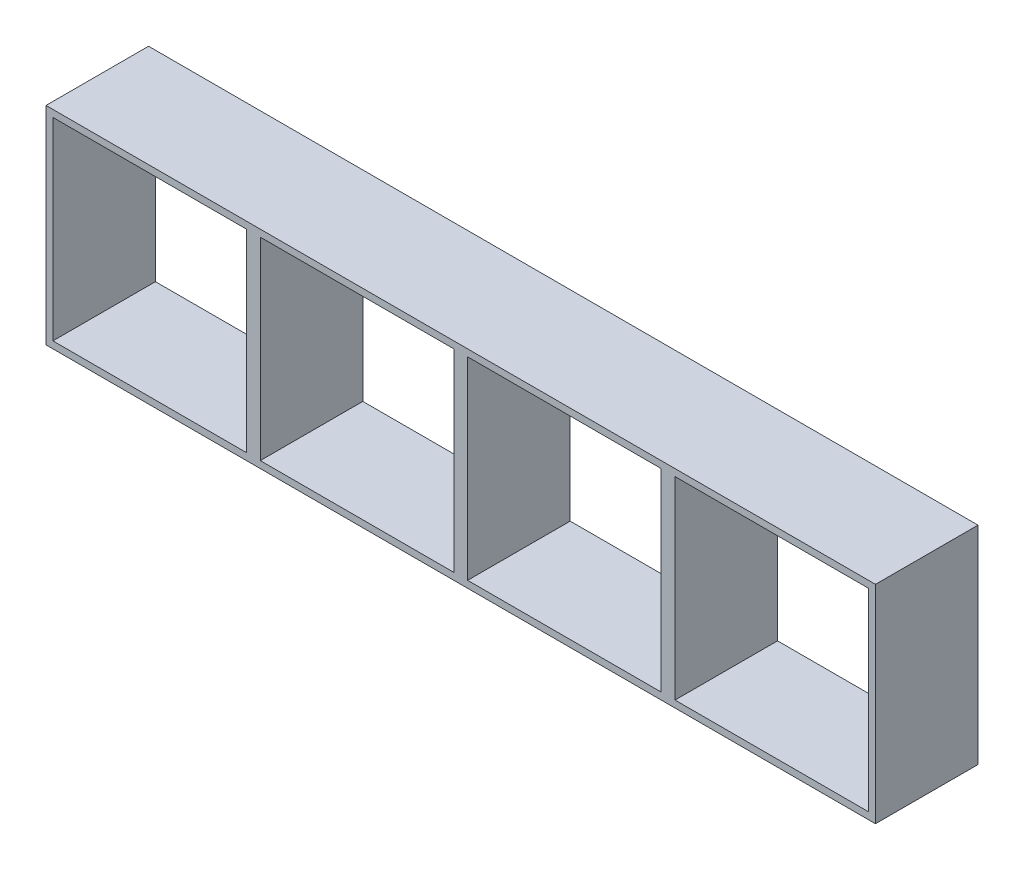
ISO-10303-21;
HEADER;
FILE_DESCRIPTION(('STEP AP214'),'2;1');
FILE_NAME('part.step','',(''),(''),'','','');
FILE_SCHEMA(('AUTOMOTIVE_DESIGN { 1 0 10303 214 1 1 1 1 }'));
ENDSEC;
DATA;
#1=APPLICATION_CONTEXT('core data for automotive mechanical design processes');
#2=APPLICATION_PROTOCOL_DEFINITION('international standard','automotive_design',2000,#1);
#3=PRODUCT_CONTEXT('',#1,'mechanical');
#4=PRODUCT('Part','Part','',(#3));
#5=PRODUCT_RELATED_PRODUCT_CATEGORY('part','',(#4));
#6=PRODUCT_DEFINITION_FORMATION('','',#4);
#7=PRODUCT_DEFINITION_CONTEXT('part definition',#1,'design');
#8=PRODUCT_DEFINITION('design','',#6,#7);
#9=PRODUCT_DEFINITION_SHAPE('','',#8);
#10=(LENGTH_UNIT() NAMED_UNIT(*) SI_UNIT(.MILLI.,.METRE.));
#11=(NAMED_UNIT(*) PLANE_ANGLE_UNIT() SI_UNIT($,.RADIAN.));
#12=(NAMED_UNIT(*) SI_UNIT($,.STERADIAN.) SOLID_ANGLE_UNIT());
#13=UNCERTAINTY_MEASURE_WITH_UNIT(LENGTH_MEASURE(1.E-05),#10,'distance_accuracy_value','');
#14=(GEOMETRIC_REPRESENTATION_CONTEXT(3) GLOBAL_UNCERTAINTY_ASSIGNED_CONTEXT((#13)) GLOBAL_UNIT_ASSIGNED_CONTEXT((#10,
#11,#12)) REPRESENTATION_CONTEXT('',''));
#15=CARTESIAN_POINT('',(0.,0.,0.));
#16=DIRECTION('',(0.,0.,1.));
#17=DIRECTION('',(1.,0.,0.));
#18=AXIS2_PLACEMENT_3D('',#15,#16,#17);
#19=CARTESIAN_POINT('',(0.,0.,14.8333333433333));
#20=DIRECTION('',(-1.,0.,0.));
#21=DIRECTION('',(0.,0.,1.));
#22=AXIS2_PLACEMENT_3D('',#19,#20,#21);
#23=PLANE('',#22);
#24=DIRECTION('',(0.,1.,0.));
#25=VECTOR('',#24,1.);
#26=CARTESIAN_POINT('',(0.,0.,0.));
#27=LINE('',#26,#25);
#28=CARTESIAN_POINT('',(0.,0.,0.));
#29=VERTEX_POINT('',#28);
#30=CARTESIAN_POINT('',(0.,30.,0.));
#31=VERTEX_POINT('',#30);
#32=EDGE_CURVE('E305',#29,#31,#27,.T.);
#33=ORIENTED_EDGE('',*,*,#32,.F.);
#34=DIRECTION('',(0.,0.,-1.));
#35=VECTOR('',#34,1.);
#36=CARTESIAN_POINT('',(0.,0.,14.8333333433333));
#37=LINE('',#36,#35);
#38=CARTESIAN_POINT('',(0.,0.,14.8333333433333));
#39=VERTEX_POINT('',#38);
#40=EDGE_CURVE('E11',#39,#29,#37,.T.);
#41=ORIENTED_EDGE('',*,*,#40,.F.);
#42=DIRECTION('',(0.,1.,0.));
#43=VECTOR('',#42,1.);
#44=CARTESIAN_POINT('',(0.,0.,14.8333333433333));
#45=LINE('',#44,#43);
#46=CARTESIAN_POINT('',(0.,30.,14.8333333433333));
#47=VERTEX_POINT('',#46);
#48=EDGE_CURVE('E200',#39,#47,#45,.T.);
#49=ORIENTED_EDGE('',*,*,#48,.T.);
#50=DIRECTION('',(0.,0.,-1.));
#51=VECTOR('',#50,1.);
#52=CARTESIAN_POINT('',(0.,30.,14.8333333433333));
#53=LINE('',#52,#51);
#54=EDGE_CURVE('E62',#47,#31,#53,.T.);
#55=ORIENTED_EDGE('',*,*,#54,.T.);
#56=EDGE_LOOP('',(#33,#41,#49,#55));
#57=FACE_BOUND('',#56,.T.);
#58=ADVANCED_FACE('F43',(#57),#23,.T.);
#59=CARTESIAN_POINT('',(0.,0.,14.8333333433333));
#60=DIRECTION('',(0.,1.,0.));
#61=DIRECTION('',(-1.,0.,0.));
#62=AXIS2_PLACEMENT_3D('',#59,#60,#61);
#63=PLANE('',#62);
#64=DIRECTION('',(1.,0.,0.));
#65=VECTOR('',#64,1.);
#66=CARTESIAN_POINT('',(0.,0.,0.));
#67=LINE('',#66,#65);
#68=CARTESIAN_POINT('',(120.,0.,0.));
#69=VERTEX_POINT('',#68);
#70=EDGE_CURVE('E205',#29,#69,#67,.T.);
#71=ORIENTED_EDGE('',*,*,#70,.T.);
#72=DIRECTION('',(0.,0.,-1.));
#73=VECTOR('',#72,1.);
#74=CARTESIAN_POINT('',(120.,0.,14.8333333433333));
#75=LINE('',#74,#73);
#76=CARTESIAN_POINT('',(120.,0.,14.8333333433333));
#77=VERTEX_POINT('',#76);
#78=EDGE_CURVE('E53',#77,#69,#75,.T.);
#79=ORIENTED_EDGE('',*,*,#78,.F.);
#80=DIRECTION('',(1.,0.,0.));
#81=VECTOR('',#80,1.);
#82=CARTESIAN_POINT('',(0.,0.,14.8333333433333));
#83=LINE('',#82,#81);
#84=EDGE_CURVE('E195',#39,#77,#83,.T.);
#85=ORIENTED_EDGE('',*,*,#84,.F.);
#86=ORIENTED_EDGE('',*,*,#40,.T.);
#87=EDGE_LOOP('',(#71,#79,#85,#86));
#88=FACE_BOUND('',#87,.T.);
#89=ADVANCED_FACE('F203',(#88),#63,.F.);
#90=CARTESIAN_POINT('',(120.,0.,14.8333333433333));
#91=DIRECTION('',(-1.,0.,0.));
#92=DIRECTION('',(0.,-1.,0.));
#93=AXIS2_PLACEMENT_3D('',#90,#91,#92);
#94=PLANE('',#93);
#95=DIRECTION('',(0.,1.,0.));
#96=VECTOR('',#95,1.);
#97=CARTESIAN_POINT('',(120.,0.,0.));
#98=LINE('',#97,#96);
#99=CARTESIAN_POINT('',(120.,30.,0.));
#100=VERTEX_POINT('',#99);
#101=EDGE_CURVE('E308',#69,#100,#98,.T.);
#102=ORIENTED_EDGE('',*,*,#101,.T.);
#103=DIRECTION('',(0.,0.,-1.));
#104=VECTOR('',#103,1.);
#105=CARTESIAN_POINT('',(120.,30.,14.8333333433333));
#106=LINE('',#105,#104);
#107=CARTESIAN_POINT('',(120.,30.,14.8333333433333));
#108=VERTEX_POINT('',#107);
#109=EDGE_CURVE('E124',#108,#100,#106,.T.);
#110=ORIENTED_EDGE('',*,*,#109,.F.);
#111=DIRECTION('',(0.,1.,0.));
#112=VECTOR('',#111,1.);
#113=CARTESIAN_POINT('',(120.,0.,14.8333333433333));
#114=LINE('',#113,#112);
#115=EDGE_CURVE('E187',#77,#108,#114,.T.);
#116=ORIENTED_EDGE('',*,*,#115,.F.);
#117=ORIENTED_EDGE('',*,*,#78,.T.);
#118=EDGE_LOOP('',(#102,#110,#116,#117));
#119=FACE_BOUND('',#118,.T.);
#120=ADVANCED_FACE('F189',(#119),#94,.F.);
#121=CARTESIAN_POINT('',(0.,1.,14.8333333433333));
#122=DIRECTION('',(0.,1.,0.));
#123=DIRECTION('',(0.,0.,1.));
#124=AXIS2_PLACEMENT_3D('',#121,#122,#123);
#125=PLANE('',#124);
#126=DIRECTION('',(1.,0.,0.));
#127=VECTOR('',#126,1.);
#128=CARTESIAN_POINT('',(0.,1.,0.));
#129=LINE('',#128,#127);
#130=CARTESIAN_POINT('',(1.,1.,0.));
#131=VERTEX_POINT('',#130);
#132=CARTESIAN_POINT('',(29.,1.,0.));
#133=VERTEX_POINT('',#132);
#134=EDGE_CURVE('E293',#131,#133,#129,.T.);
#135=ORIENTED_EDGE('',*,*,#134,.F.);
#136=DIRECTION('',(0.,0.,-1.));
#137=VECTOR('',#136,1.);
#138=CARTESIAN_POINT('',(1.,1.,14.8333333433333));
#139=LINE('',#138,#137);
#140=CARTESIAN_POINT('',(1.,1.,14.8333333433333));
#141=VERTEX_POINT('',#140);
#142=EDGE_CURVE('E217',#141,#131,#139,.T.);
#143=ORIENTED_EDGE('',*,*,#142,.F.);
#144=DIRECTION('',(1.,0.,0.));
#145=VECTOR('',#144,1.);
#146=CARTESIAN_POINT('',(0.,1.,14.8333333433333));
#147=LINE('',#146,#145);
#148=CARTESIAN_POINT('',(29.,1.,14.8333333433333));
#149=VERTEX_POINT('',#148);
#150=EDGE_CURVE('E345',#141,#149,#147,.T.);
#151=ORIENTED_EDGE('',*,*,#150,.T.);
#152=DIRECTION('',(0.,0.,-1.));
#153=VECTOR('',#152,1.);
#154=CARTESIAN_POINT('',(29.,1.,14.8333333433333));
#155=LINE('',#154,#153);
#156=EDGE_CURVE('E210',#149,#133,#155,.T.);
#157=ORIENTED_EDGE('',*,*,#156,.T.);
#158=EDGE_LOOP('',(#135,#143,#151,#157));
#159=FACE_BOUND('',#158,.T.);
#160=ADVANCED_FACE('F393',(#159),#125,.T.);
#161=CARTESIAN_POINT('',(1.,0.,14.8333333433333));
#162=DIRECTION('',(1.,0.,0.));
#163=DIRECTION('',(0.,1.,0.));
#164=AXIS2_PLACEMENT_3D('',#161,#162,#163);
#165=PLANE('',#164);
#166=DIRECTION('',(0.,-1.,0.));
#167=VECTOR('',#166,1.);
#168=CARTESIAN_POINT('',(1.,0.,0.));
#169=LINE('',#168,#167);
#170=CARTESIAN_POINT('',(1.,29.,0.));
#171=VERTEX_POINT('',#170);
#172=EDGE_CURVE('E296',#171,#131,#169,.T.);
#173=ORIENTED_EDGE('',*,*,#172,.F.);
#174=DIRECTION('',(0.,0.,-1.));
#175=VECTOR('',#174,1.);
#176=CARTESIAN_POINT('',(1.,29.,14.8333333433333));
#177=LINE('',#176,#175);
#178=CARTESIAN_POINT('',(1.,29.,14.8333333433333));
#179=VERTEX_POINT('',#178);
#180=EDGE_CURVE('E215',#179,#171,#177,.T.);
#181=ORIENTED_EDGE('',*,*,#180,.F.);
#182=DIRECTION('',(0.,-1.,0.));
#183=VECTOR('',#182,1.);
#184=CARTESIAN_POINT('',(1.,0.,14.8333333433333));
#185=LINE('',#184,#183);
#186=EDGE_CURVE('E348',#179,#141,#185,.T.);
#187=ORIENTED_EDGE('',*,*,#186,.T.);
#188=ORIENTED_EDGE('',*,*,#142,.T.);
#189=EDGE_LOOP('',(#173,#181,#187,#188));
#190=FACE_BOUND('',#189,.T.);
#191=ADVANCED_FACE('F389',(#190),#165,.T.);
#192=CARTESIAN_POINT('',(0.,29.,14.8333333433333));
#193=DIRECTION('',(0.,-1.,0.));
#194=DIRECTION('',(1.,0.,0.));
#195=AXIS2_PLACEMENT_3D('',#192,#193,#194);
#196=PLANE('',#195);
#197=DIRECTION('',(-1.,0.,0.));
#198=VECTOR('',#197,1.);
#199=CARTESIAN_POINT('',(0.,29.,0.));
#200=LINE('',#199,#198);
#201=CARTESIAN_POINT('',(29.,29.,0.));
#202=VERTEX_POINT('',#201);
#203=EDGE_CURVE('E299',#202,#171,#200,.T.);
#204=ORIENTED_EDGE('',*,*,#203,.F.);
#205=DIRECTION('',(0.,0.,-1.));
#206=VECTOR('',#205,1.);
#207=CARTESIAN_POINT('',(29.,29.,14.8333333433333));
#208=LINE('',#207,#206);
#209=CARTESIAN_POINT('',(29.,29.,14.8333333433333));
#210=VERTEX_POINT('',#209);
#211=EDGE_CURVE('E212',#210,#202,#208,.T.);
#212=ORIENTED_EDGE('',*,*,#211,.F.);
#213=DIRECTION('',(-1.,0.,0.));
#214=VECTOR('',#213,1.);
#215=CARTESIAN_POINT('',(0.,29.,14.8333333433333));
#216=LINE('',#215,#214);
#217=EDGE_CURVE('E351',#210,#179,#216,.T.);
#218=ORIENTED_EDGE('',*,*,#217,.T.);
#219=ORIENTED_EDGE('',*,*,#180,.T.);
#220=EDGE_LOOP('',(#204,#212,#218,#219));
#221=FACE_BOUND('',#220,.T.);
#222=ADVANCED_FACE('F385',(#221),#196,.T.);
#223=CARTESIAN_POINT('',(0.,0.999999999999982,14.8333333433333));
#224=DIRECTION('',(0.,1.,0.));
#225=DIRECTION('',(-1.,0.,0.));
#226=AXIS2_PLACEMENT_3D('',#223,#224,#225);
#227=PLANE('',#226);
#228=DIRECTION('',(1.,0.,0.));
#229=VECTOR('',#228,1.);
#230=CARTESIAN_POINT('',(0.,0.999999999999982,0.));
#231=LINE('',#230,#229);
#232=CARTESIAN_POINT('',(91.,1.00000000000001,0.));
#233=VERTEX_POINT('',#232);
#234=CARTESIAN_POINT('',(119.,1.00000000000002,0.));
#235=VERTEX_POINT('',#234);
#236=EDGE_CURVE('E281',#233,#235,#231,.T.);
#237=ORIENTED_EDGE('',*,*,#236,.F.);
#238=DIRECTION('',(0.,0.,-1.));
#239=VECTOR('',#238,1.);
#240=CARTESIAN_POINT('',(91.,1.00000000000001,14.8333333433333));
#241=LINE('',#240,#239);
#242=CARTESIAN_POINT('',(91.,1.00000000000001,14.8333333433333));
#243=VERTEX_POINT('',#242);
#244=EDGE_CURVE('E213',#243,#233,#241,.T.);
#245=ORIENTED_EDGE('',*,*,#244,.F.);
#246=DIRECTION('',(1.,0.,0.));
#247=VECTOR('',#246,1.);
#248=CARTESIAN_POINT('',(0.,0.999999999999982,14.8333333433333));
#249=LINE('',#248,#247);
#250=CARTESIAN_POINT('',(119.,1.00000000000002,14.8333333433333));
#251=VERTEX_POINT('',#250);
#252=EDGE_CURVE('E334',#243,#251,#249,.T.);
#253=ORIENTED_EDGE('',*,*,#252,.T.);
#254=DIRECTION('',(0.,0.,-1.));
#255=VECTOR('',#254,1.);
#256=CARTESIAN_POINT('',(119.,1.00000000000002,14.8333333433333));
#257=LINE('',#256,#255);
#258=EDGE_CURVE('E219',#251,#235,#257,.T.);
#259=ORIENTED_EDGE('',*,*,#258,.T.);
#260=EDGE_LOOP('',(#237,#245,#253,#259));
#261=FACE_BOUND('',#260,.T.);
#262=ADVANCED_FACE('F388',(#261),#227,.T.);
#263=CARTESIAN_POINT('',(91.,0.,14.8333333433333));
#264=DIRECTION('',(-1.,0.,0.));
#265=DIRECTION('',(0.,0.,1.));
#266=AXIS2_PLACEMENT_3D('',#263,#264,#265);
#267=PLANE('',#266);
#268=DIRECTION('',(0.,1.,0.));
#269=VECTOR('',#268,1.);
#270=CARTESIAN_POINT('',(91.,0.,0.));
#271=LINE('',#270,#269);
#272=CARTESIAN_POINT('',(91.,29.,0.));
#273=VERTEX_POINT('',#272);
#274=EDGE_CURVE('E284',#233,#273,#271,.T.);
#275=ORIENTED_EDGE('',*,*,#274,.T.);
#276=DIRECTION('',(0.,0.,-1.));
#277=VECTOR('',#276,1.);
#278=CARTESIAN_POINT('',(91.,29.,14.8333333433333));
#279=LINE('',#278,#277);
#280=CARTESIAN_POINT('',(91.,29.,14.8333333433333));
#281=VERTEX_POINT('',#280);
#282=EDGE_CURVE('E225',#281,#273,#279,.T.);
#283=ORIENTED_EDGE('',*,*,#282,.F.);
#284=DIRECTION('',(0.,1.,0.));
#285=VECTOR('',#284,1.);
#286=CARTESIAN_POINT('',(91.,0.,14.8333333433333));
#287=LINE('',#286,#285);
#288=EDGE_CURVE('E337',#243,#281,#287,.T.);
#289=ORIENTED_EDGE('',*,*,#288,.F.);
#290=ORIENTED_EDGE('',*,*,#244,.T.);
#291=EDGE_LOOP('',(#275,#283,#289,#290));
#292=FACE_BOUND('',#291,.T.);
#293=ADVANCED_FACE('F405',(#292),#267,.F.);
#294=CARTESIAN_POINT('',(0.,29.,14.8333333433333));
#295=DIRECTION('',(0.,1.,0.));
#296=DIRECTION('',(-1.,0.,0.));
#297=AXIS2_PLACEMENT_3D('',#294,#295,#296);
#298=PLANE('',#297);
#299=DIRECTION('',(1.,0.,0.));
#300=VECTOR('',#299,1.);
#301=CARTESIAN_POINT('',(0.,29.,0.));
#302=LINE('',#301,#300);
#303=CARTESIAN_POINT('',(119.,29.,0.));
#304=VERTEX_POINT('',#303);
#305=EDGE_CURVE('E287',#273,#304,#302,.T.);
#306=ORIENTED_EDGE('',*,*,#305,.T.);
#307=DIRECTION('',(0.,0.,-1.));
#308=VECTOR('',#307,1.);
#309=CARTESIAN_POINT('',(119.,29.,14.8333333433333));
#310=LINE('',#309,#308);
#311=CARTESIAN_POINT('',(119.,29.,14.8333333433333));
#312=VERTEX_POINT('',#311);
#313=EDGE_CURVE('E221',#312,#304,#310,.T.);
#314=ORIENTED_EDGE('',*,*,#313,.F.);
#315=DIRECTION('',(1.,0.,0.));
#316=VECTOR('',#315,1.);
#317=CARTESIAN_POINT('',(0.,29.,14.8333333433333));
#318=LINE('',#317,#316);
#319=EDGE_CURVE('E340',#281,#312,#318,.T.);
#320=ORIENTED_EDGE('',*,*,#319,.F.);
#321=ORIENTED_EDGE('',*,*,#282,.T.);
#322=EDGE_LOOP('',(#306,#314,#320,#321));
#323=FACE_BOUND('',#322,.T.);
#324=ADVANCED_FACE('F401',(#323),#298,.F.);
#325=CARTESIAN_POINT('',(0.,0.999999999999983,14.8333333433333));
#326=DIRECTION('',(0.,1.,0.));
#327=DIRECTION('',(-1.,0.,0.));
#328=AXIS2_PLACEMENT_3D('',#325,#326,#327);
#329=PLANE('',#328);
#330=DIRECTION('',(1.,0.,0.));
#331=VECTOR('',#330,1.);
#332=CARTESIAN_POINT('',(0.,0.999999999999983,0.));
#333=LINE('',#332,#331);
#334=CARTESIAN_POINT('',(61.,1.,0.));
#335=VERTEX_POINT('',#334);
#336=CARTESIAN_POINT('',(89.,1.00000000000001,0.));
#337=VERTEX_POINT('',#336);
#338=EDGE_CURVE('E269',#335,#337,#333,.T.);
#339=ORIENTED_EDGE('',*,*,#338,.F.);
#340=DIRECTION('',(0.,0.,-1.));
#341=VECTOR('',#340,1.);
#342=CARTESIAN_POINT('',(61.,1.,14.8333333433333));
#343=LINE('',#342,#341);
#344=CARTESIAN_POINT('',(61.,1.,14.8333333433333));
#345=VERTEX_POINT('',#344);
#346=EDGE_CURVE('E222',#345,#335,#343,.T.);
#347=ORIENTED_EDGE('',*,*,#346,.F.);
#348=DIRECTION('',(1.,0.,0.));
#349=VECTOR('',#348,1.);
#350=CARTESIAN_POINT('',(0.,0.999999999999983,14.8333333433333));
#351=LINE('',#350,#349);
#352=CARTESIAN_POINT('',(89.,1.00000000000001,14.8333333433333));
#353=VERTEX_POINT('',#352);
#354=EDGE_CURVE('E323',#345,#353,#351,.T.);
#355=ORIENTED_EDGE('',*,*,#354,.T.);
#356=DIRECTION('',(0.,0.,-1.));
#357=VECTOR('',#356,1.);
#358=CARTESIAN_POINT('',(89.,1.00000000000001,14.8333333433333));
#359=LINE('',#358,#357);
#360=EDGE_CURVE('E229',#353,#337,#359,.T.);
#361=ORIENTED_EDGE('',*,*,#360,.T.);
#362=EDGE_LOOP('',(#339,#347,#355,#361));
#363=FACE_BOUND('',#362,.T.);
#364=ADVANCED_FACE('F404',(#363),#329,.T.);
#365=CARTESIAN_POINT('',(61.,0.,14.8333333433333));
#366=DIRECTION('',(-1.,0.,0.));
#367=DIRECTION('',(0.,-1.,0.));
#368=AXIS2_PLACEMENT_3D('',#365,#366,#367);
#369=PLANE('',#368);
#370=DIRECTION('',(0.,1.,0.));
#371=VECTOR('',#370,1.);
#372=CARTESIAN_POINT('',(61.,0.,0.));
#373=LINE('',#372,#371);
#374=CARTESIAN_POINT('',(61.,29.,0.));
#375=VERTEX_POINT('',#374);
#376=EDGE_CURVE('E272',#335,#375,#373,.T.);
#377=ORIENTED_EDGE('',*,*,#376,.T.);
#378=DIRECTION('',(0.,0.,-1.));
#379=VECTOR('',#378,1.);
#380=CARTESIAN_POINT('',(61.,29.,14.8333333433333));
#381=LINE('',#380,#379);
#382=CARTESIAN_POINT('',(61.,29.,14.8333333433333));
#383=VERTEX_POINT('',#382);
#384=EDGE_CURVE('E234',#383,#375,#381,.T.);
#385=ORIENTED_EDGE('',*,*,#384,.F.);
#386=DIRECTION('',(0.,1.,0.));
#387=VECTOR('',#386,1.);
#388=CARTESIAN_POINT('',(61.,0.,14.8333333433333));
#389=LINE('',#388,#387);
#390=EDGE_CURVE('E326',#345,#383,#389,.T.);
#391=ORIENTED_EDGE('',*,*,#390,.F.);
#392=ORIENTED_EDGE('',*,*,#346,.T.);
#393=EDGE_LOOP('',(#377,#385,#391,#392));
#394=FACE_BOUND('',#393,.T.);
#395=ADVANCED_FACE('F419',(#394),#369,.F.);
#396=CARTESIAN_POINT('',(0.,29.,14.8333333433333));
#397=DIRECTION('',(0.,1.,0.));
#398=DIRECTION('',(0.,0.,1.));
#399=AXIS2_PLACEMENT_3D('',#396,#397,#398);
#400=PLANE('',#399);
#401=DIRECTION('',(1.,0.,0.));
#402=VECTOR('',#401,1.);
#403=CARTESIAN_POINT('',(0.,29.,0.));
#404=LINE('',#403,#402);
#405=CARTESIAN_POINT('',(89.,29.,0.));
#406=VERTEX_POINT('',#405);
#407=EDGE_CURVE('E275',#375,#406,#404,.T.);
#408=ORIENTED_EDGE('',*,*,#407,.T.);
#409=DIRECTION('',(0.,0.,-1.));
#410=VECTOR('',#409,1.);
#411=CARTESIAN_POINT('',(89.,29.,14.8333333433333));
#412=LINE('',#411,#410);
#413=CARTESIAN_POINT('',(89.,29.,14.8333333433333));
#414=VERTEX_POINT('',#413);
#415=EDGE_CURVE('E231',#414,#406,#412,.T.);
#416=ORIENTED_EDGE('',*,*,#415,.F.);
#417=DIRECTION('',(1.,0.,0.));
#418=VECTOR('',#417,1.);
#419=CARTESIAN_POINT('',(0.,29.,14.8333333433333));
#420=LINE('',#419,#418);
#421=EDGE_CURVE('E329',#383,#414,#420,.T.);
#422=ORIENTED_EDGE('',*,*,#421,.F.);
#423=ORIENTED_EDGE('',*,*,#384,.T.);
#424=EDGE_LOOP('',(#408,#416,#422,#423));
#425=FACE_BOUND('',#424,.T.);
#426=ADVANCED_FACE('F416',(#425),#400,.F.);
#427=CARTESIAN_POINT('',(0.,1.,14.8333333433333));
#428=DIRECTION('',(0.,1.,0.));
#429=DIRECTION('',(-1.,0.,0.));
#430=AXIS2_PLACEMENT_3D('',#427,#428,#429);
#431=PLANE('',#430);
#432=DIRECTION('',(1.,0.,0.));
#433=VECTOR('',#432,1.);
#434=CARTESIAN_POINT('',(0.,1.,0.));
#435=LINE('',#434,#433);
#436=CARTESIAN_POINT('',(31.,1.,0.));
#437=VERTEX_POINT('',#436);
#438=CARTESIAN_POINT('',(59.,1.,0.));
#439=VERTEX_POINT('',#438);
#440=EDGE_CURVE('E255',#437,#439,#435,.T.);
#441=ORIENTED_EDGE('',*,*,#440,.F.);
#442=DIRECTION('',(0.,0.,-1.));
#443=VECTOR('',#442,1.);
#444=CARTESIAN_POINT('',(31.,1.,14.8333333433333));
#445=LINE('',#444,#443);
#446=CARTESIAN_POINT('',(31.,1.,14.8333333433333));
#447=VERTEX_POINT('',#446);
#448=EDGE_CURVE('E47',#447,#437,#445,.T.);
#449=ORIENTED_EDGE('',*,*,#448,.F.);
#450=DIRECTION('',(1.,0.,0.));
#451=VECTOR('',#450,1.);
#452=CARTESIAN_POINT('',(0.,1.,14.8333333433333));
#453=LINE('',#452,#451);
#454=CARTESIAN_POINT('',(59.,1.,14.8333333433333));
#455=VERTEX_POINT('',#454);
#456=EDGE_CURVE('E312',#447,#455,#453,.T.);
#457=ORIENTED_EDGE('',*,*,#456,.T.);
#458=DIRECTION('',(0.,0.,-1.));
#459=VECTOR('',#458,1.);
#460=CARTESIAN_POINT('',(59.,1.,14.8333333433333));
#461=LINE('',#460,#459);
#462=EDGE_CURVE('E238',#455,#439,#461,.T.);
#463=ORIENTED_EDGE('',*,*,#462,.T.);
#464=EDGE_LOOP('',(#441,#449,#457,#463));
#465=FACE_BOUND('',#464,.T.);
#466=ADVANCED_FACE('F45',(#465),#431,.T.);
#467=CARTESIAN_POINT('',(31.,0.,14.8333333433333));
#468=DIRECTION('',(1.,0.,0.));
#469=DIRECTION('',(0.,1.,0.));
#470=AXIS2_PLACEMENT_3D('',#467,#468,#469);
#471=PLANE('',#470);
#472=DIRECTION('',(0.,-1.,0.));
#473=VECTOR('',#472,1.);
#474=CARTESIAN_POINT('',(31.,0.,0.));
#475=LINE('',#474,#473);
#476=CARTESIAN_POINT('',(31.,29.,0.));
#477=VERTEX_POINT('',#476);
#478=EDGE_CURVE('E250',#477,#437,#475,.T.);
#479=ORIENTED_EDGE('',*,*,#478,.F.);
#480=DIRECTION('',(0.,0.,-1.));
#481=VECTOR('',#480,1.);
#482=CARTESIAN_POINT('',(31.,29.,14.8333333433333));
#483=LINE('',#482,#481);
#484=CARTESIAN_POINT('',(31.,29.,14.8333333433333));
#485=VERTEX_POINT('',#484);
#486=EDGE_CURVE('E241',#485,#477,#483,.T.);
#487=ORIENTED_EDGE('',*,*,#486,.F.);
#488=DIRECTION('',(0.,-1.,0.));
#489=VECTOR('',#488,1.);
#490=CARTESIAN_POINT('',(31.,0.,14.8333333433333));
#491=LINE('',#490,#489);
#492=EDGE_CURVE('E253',#485,#447,#491,.T.);
#493=ORIENTED_EDGE('',*,*,#492,.T.);
#494=ORIENTED_EDGE('',*,*,#448,.T.);
#495=EDGE_LOOP('',(#479,#487,#493,#494));
#496=FACE_BOUND('',#495,.T.);
#497=ADVANCED_FACE('F248',(#496),#471,.T.);
#498=CARTESIAN_POINT('',(0.,29.,14.8333333433333));
#499=DIRECTION('',(0.,-1.,0.));
#500=DIRECTION('',(1.,0.,0.));
#501=AXIS2_PLACEMENT_3D('',#498,#499,#500);
#502=PLANE('',#501);
#503=DIRECTION('',(-1.,0.,0.));
#504=VECTOR('',#503,1.);
#505=CARTESIAN_POINT('',(0.,29.,0.));
#506=LINE('',#505,#504);
#507=CARTESIAN_POINT('',(59.,29.,0.));
#508=VERTEX_POINT('',#507);
#509=EDGE_CURVE('E262',#508,#477,#506,.T.);
#510=ORIENTED_EDGE('',*,*,#509,.F.);
#511=DIRECTION('',(0.,0.,-1.));
#512=VECTOR('',#511,1.);
#513=CARTESIAN_POINT('',(59.,29.,14.8333333433333));
#514=LINE('',#513,#512);
#515=CARTESIAN_POINT('',(59.,29.,14.8333333433333));
#516=VERTEX_POINT('',#515);
#517=EDGE_CURVE('E240',#516,#508,#514,.T.);
#518=ORIENTED_EDGE('',*,*,#517,.F.);
#519=DIRECTION('',(-1.,0.,0.));
#520=VECTOR('',#519,1.);
#521=CARTESIAN_POINT('',(0.,29.,14.8333333433333));
#522=LINE('',#521,#520);
#523=EDGE_CURVE('E316',#516,#485,#522,.T.);
#524=ORIENTED_EDGE('',*,*,#523,.T.);
#525=ORIENTED_EDGE('',*,*,#486,.T.);
#526=EDGE_LOOP('',(#510,#518,#524,#525));
#527=FACE_BOUND('',#526,.T.);
#528=ADVANCED_FACE('F383',(#527),#502,.T.);
#529=CARTESIAN_POINT('',(29.,0.,14.8333333433333));
#530=DIRECTION('',(-1.,0.,0.));
#531=DIRECTION('',(0.,0.,1.));
#532=AXIS2_PLACEMENT_3D('',#529,#530,#531);
#533=PLANE('',#532);
#534=DIRECTION('',(0.,1.,0.));
#535=VECTOR('',#534,1.);
#536=CARTESIAN_POINT('',(29.,0.,0.));
#537=LINE('',#536,#535);
#538=EDGE_CURVE('E302',#133,#202,#537,.T.);
#539=ORIENTED_EDGE('',*,*,#538,.F.);
#540=ORIENTED_EDGE('',*,*,#156,.F.);
#541=DIRECTION('',(0.,1.,0.));
#542=VECTOR('',#541,1.);
#543=CARTESIAN_POINT('',(29.,0.,14.8333333433333));
#544=LINE('',#543,#542);
#545=EDGE_CURVE('E354',#149,#210,#544,.T.);
#546=ORIENTED_EDGE('',*,*,#545,.T.);
#547=ORIENTED_EDGE('',*,*,#211,.T.);
#548=EDGE_LOOP('',(#539,#540,#546,#547));
#549=FACE_BOUND('',#548,.T.);
#550=ADVANCED_FACE('F379',(#549),#533,.T.);
#551=CARTESIAN_POINT('',(119.,0.,14.8333333433333));
#552=DIRECTION('',(1.,0.,0.));
#553=DIRECTION('',(0.,1.,0.));
#554=AXIS2_PLACEMENT_3D('',#551,#552,#553);
#555=PLANE('',#554);
#556=DIRECTION('',(0.,-1.,0.));
#557=VECTOR('',#556,1.);
#558=CARTESIAN_POINT('',(119.,0.,0.));
#559=LINE('',#558,#557);
#560=EDGE_CURVE('E290',#304,#235,#559,.T.);
#561=ORIENTED_EDGE('',*,*,#560,.T.);
#562=ORIENTED_EDGE('',*,*,#258,.F.);
#563=DIRECTION('',(0.,-1.,0.));
#564=VECTOR('',#563,1.);
#565=CARTESIAN_POINT('',(119.,0.,14.8333333433333));
#566=LINE('',#565,#564);
#567=EDGE_CURVE('E343',#312,#251,#566,.T.);
#568=ORIENTED_EDGE('',*,*,#567,.F.);
#569=ORIENTED_EDGE('',*,*,#313,.T.);
#570=EDGE_LOOP('',(#561,#562,#568,#569));
#571=FACE_BOUND('',#570,.T.);
#572=ADVANCED_FACE('F382',(#571),#555,.F.);
#573=CARTESIAN_POINT('',(89.,0.,14.8333333433333));
#574=DIRECTION('',(1.,0.,0.));
#575=DIRECTION('',(0.,0.,-1.));
#576=AXIS2_PLACEMENT_3D('',#573,#574,#575);
#577=PLANE('',#576);
#578=DIRECTION('',(0.,-1.,0.));
#579=VECTOR('',#578,1.);
#580=CARTESIAN_POINT('',(89.,0.,0.));
#581=LINE('',#580,#579);
#582=EDGE_CURVE('E278',#406,#337,#581,.T.);
#583=ORIENTED_EDGE('',*,*,#582,.T.);
#584=ORIENTED_EDGE('',*,*,#360,.F.);
#585=DIRECTION('',(0.,-1.,0.));
#586=VECTOR('',#585,1.);
#587=CARTESIAN_POINT('',(89.,0.,14.8333333433333));
#588=LINE('',#587,#586);
#589=EDGE_CURVE('E332',#414,#353,#588,.T.);
#590=ORIENTED_EDGE('',*,*,#589,.F.);
#591=ORIENTED_EDGE('',*,*,#415,.T.);
#592=EDGE_LOOP('',(#583,#584,#590,#591));
#593=FACE_BOUND('',#592,.T.);
#594=ADVANCED_FACE('F367',(#593),#577,.F.);
#595=CARTESIAN_POINT('',(59.,0.,14.8333333433333));
#596=DIRECTION('',(-1.,0.,0.));
#597=DIRECTION('',(0.,0.,1.));
#598=AXIS2_PLACEMENT_3D('',#595,#596,#597);
#599=PLANE('',#598);
#600=DIRECTION('',(0.,1.,0.));
#601=VECTOR('',#600,1.);
#602=CARTESIAN_POINT('',(59.,0.,0.));
#603=LINE('',#602,#601);
#604=EDGE_CURVE('E264',#439,#508,#603,.T.);
#605=ORIENTED_EDGE('',*,*,#604,.F.);
#606=ORIENTED_EDGE('',*,*,#462,.F.);
#607=DIRECTION('',(0.,1.,0.));
#608=VECTOR('',#607,1.);
#609=CARTESIAN_POINT('',(59.,0.,14.8333333433333));
#610=LINE('',#609,#608);
#611=EDGE_CURVE('E320',#455,#516,#610,.T.);
#612=ORIENTED_EDGE('',*,*,#611,.T.);
#613=ORIENTED_EDGE('',*,*,#517,.T.);
#614=EDGE_LOOP('',(#605,#606,#612,#613));
#615=FACE_BOUND('',#614,.T.);
#616=ADVANCED_FACE('F359',(#615),#599,.T.);
#617=CARTESIAN_POINT('',(0.,30.,14.8333333433333));
#618=DIRECTION('',(0.,1.,0.));
#619=DIRECTION('',(-1.,0.,0.));
#620=AXIS2_PLACEMENT_3D('',#617,#618,#619);
#621=PLANE('',#620);
#622=DIRECTION('',(1.,0.,0.));
#623=VECTOR('',#622,1.);
#624=CARTESIAN_POINT('',(0.,30.,0.));
#625=LINE('',#624,#623);
#626=EDGE_CURVE('E310',#31,#100,#625,.T.);
#627=ORIENTED_EDGE('',*,*,#626,.F.);
#628=ORIENTED_EDGE('',*,*,#54,.F.);
#629=DIRECTION('',(1.,0.,0.));
#630=VECTOR('',#629,1.);
#631=CARTESIAN_POINT('',(0.,30.,14.8333333433333));
#632=LINE('',#631,#630);
#633=EDGE_CURVE('E194',#47,#108,#632,.T.);
#634=ORIENTED_EDGE('',*,*,#633,.T.);
#635=ORIENTED_EDGE('',*,*,#109,.T.);
#636=EDGE_LOOP('',(#627,#628,#634,#635));
#637=FACE_BOUND('',#636,.T.);
#638=ADVANCED_FACE('F357',(#637),#621,.T.);
#639=CARTESIAN_POINT('',(0.,0.,14.8333333433333));
#640=DIRECTION('',(0.,0.,1.));
#641=DIRECTION('',(1.,0.,0.));
#642=AXIS2_PLACEMENT_3D('',#639,#640,#641);
#643=PLANE('',#642);
#644=ORIENTED_EDGE('',*,*,#456,.F.);
#645=ORIENTED_EDGE('',*,*,#492,.F.);
#646=ORIENTED_EDGE('',*,*,#523,.F.);
#647=ORIENTED_EDGE('',*,*,#611,.F.);
#648=EDGE_LOOP('',(#644,#645,#646,#647));
#649=FACE_BOUND('',#648,.T.);
#650=ORIENTED_EDGE('',*,*,#354,.F.);
#651=ORIENTED_EDGE('',*,*,#390,.T.);
#652=ORIENTED_EDGE('',*,*,#421,.T.);
#653=ORIENTED_EDGE('',*,*,#589,.T.);
#654=EDGE_LOOP('',(#650,#651,#652,#653));
#655=FACE_BOUND('',#654,.T.);
#656=ORIENTED_EDGE('',*,*,#252,.F.);
#657=ORIENTED_EDGE('',*,*,#288,.T.);
#658=ORIENTED_EDGE('',*,*,#319,.T.);
#659=ORIENTED_EDGE('',*,*,#567,.T.);
#660=EDGE_LOOP('',(#656,#657,#658,#659));
#661=FACE_BOUND('',#660,.T.);
#662=ORIENTED_EDGE('',*,*,#150,.F.);
#663=ORIENTED_EDGE('',*,*,#186,.F.);
#664=ORIENTED_EDGE('',*,*,#217,.F.);
#665=ORIENTED_EDGE('',*,*,#545,.F.);
#666=EDGE_LOOP('',(#662,#663,#664,#665));
#667=FACE_BOUND('',#666,.T.);
#668=ORIENTED_EDGE('',*,*,#48,.F.);
#669=ORIENTED_EDGE('',*,*,#84,.T.);
#670=ORIENTED_EDGE('',*,*,#115,.T.);
#671=ORIENTED_EDGE('',*,*,#633,.F.);
#672=EDGE_LOOP('',(#668,#669,#670,#671));
#673=FACE_BOUND('',#672,.T.);
#674=ADVANCED_FACE('F199',(#649,#655,#661,#667,#673),#643,.T.);
#675=CARTESIAN_POINT('',(0.,0.,0.));
#676=DIRECTION('',(0.,0.,1.));
#677=DIRECTION('',(1.,0.,0.));
#678=AXIS2_PLACEMENT_3D('',#675,#676,#677);
#679=PLANE('',#678);
#680=ORIENTED_EDGE('',*,*,#440,.T.);
#681=ORIENTED_EDGE('',*,*,#604,.T.);
#682=ORIENTED_EDGE('',*,*,#509,.T.);
#683=ORIENTED_EDGE('',*,*,#478,.T.);
#684=EDGE_LOOP('',(#680,#681,#682,#683));
#685=FACE_BOUND('',#684,.T.);
#686=ORIENTED_EDGE('',*,*,#338,.T.);
#687=ORIENTED_EDGE('',*,*,#582,.F.);
#688=ORIENTED_EDGE('',*,*,#407,.F.);
#689=ORIENTED_EDGE('',*,*,#376,.F.);
#690=EDGE_LOOP('',(#686,#687,#688,#689));
#691=FACE_BOUND('',#690,.T.);
#692=ORIENTED_EDGE('',*,*,#236,.T.);
#693=ORIENTED_EDGE('',*,*,#560,.F.);
#694=ORIENTED_EDGE('',*,*,#305,.F.);
#695=ORIENTED_EDGE('',*,*,#274,.F.);
#696=EDGE_LOOP('',(#692,#693,#694,#695));
#697=FACE_BOUND('',#696,.T.);
#698=ORIENTED_EDGE('',*,*,#134,.T.);
#699=ORIENTED_EDGE('',*,*,#538,.T.);
#700=ORIENTED_EDGE('',*,*,#203,.T.);
#701=ORIENTED_EDGE('',*,*,#172,.T.);
#702=EDGE_LOOP('',(#698,#699,#700,#701));
#703=FACE_BOUND('',#702,.T.);
#704=ORIENTED_EDGE('',*,*,#32,.T.);
#705=ORIENTED_EDGE('',*,*,#626,.T.);
#706=ORIENTED_EDGE('',*,*,#101,.F.);
#707=ORIENTED_EDGE('',*,*,#70,.F.);
#708=EDGE_LOOP('',(#704,#705,#706,#707));
#709=FACE_BOUND('',#708,.T.);
#710=ADVANCED_FACE('F260',(#685,#691,#697,#703,#709),#679,.F.);
#711=CLOSED_SHELL('',(#58,#89,#120,#160,#191,#222,#262,#293,#324,#364,#395,#426,#466,#497,#528,
#550,#572,#594,#616,#638,#674,#710));
#712=MANIFOLD_SOLID_BREP('B2',#711);
#713=ADVANCED_BREP_SHAPE_REPRESENTATION('',(#18,#712),#14);
#714=SHAPE_DEFINITION_REPRESENTATION(#9,#713);
ENDSEC;
END-ISO-10303-21;
